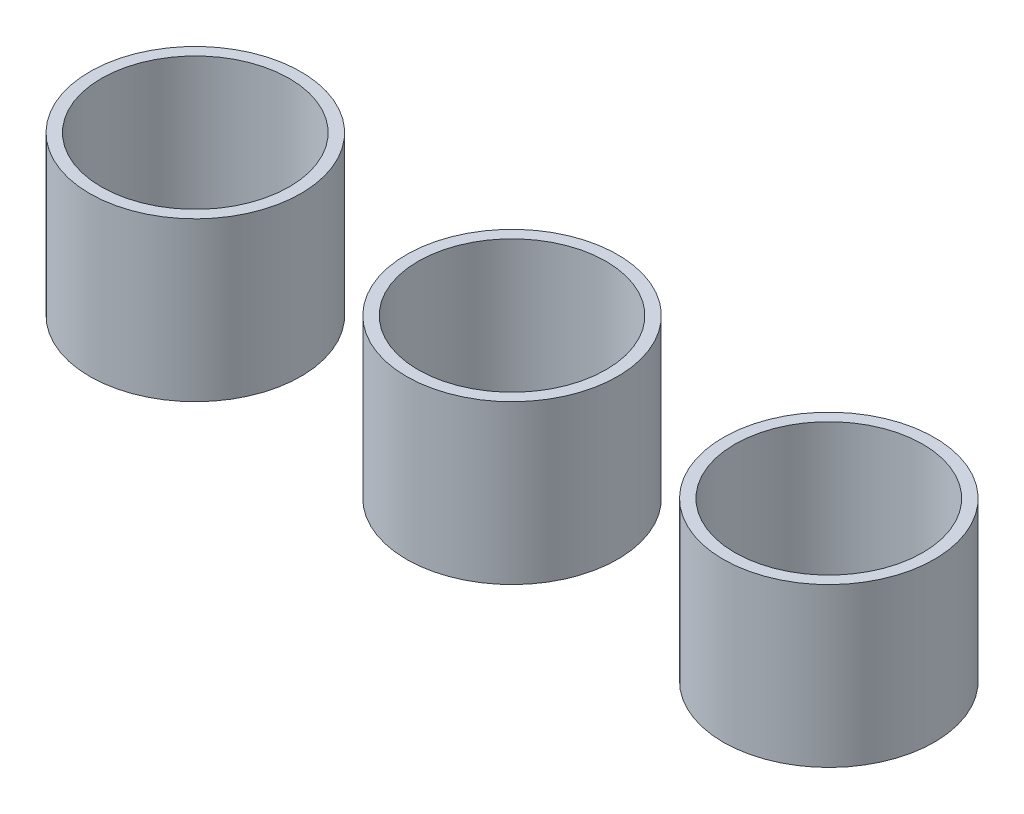
ISO-10303-21;
HEADER;
FILE_DESCRIPTION(('STEP AP214'),'2;1');
FILE_NAME('part.step','',(''),(''),'','','');
FILE_SCHEMA(('AUTOMOTIVE_DESIGN { 1 0 10303 214 1 1 1 1 }'));
ENDSEC;
DATA;
#1=APPLICATION_CONTEXT('core data for automotive mechanical design processes');
#2=APPLICATION_PROTOCOL_DEFINITION('international standard','automotive_design',2000,#1);
#3=PRODUCT_CONTEXT('',#1,'mechanical');
#4=PRODUCT('Part','Part','',(#3));
#5=PRODUCT_RELATED_PRODUCT_CATEGORY('part','',(#4));
#6=PRODUCT_DEFINITION_FORMATION('','',#4);
#7=PRODUCT_DEFINITION_CONTEXT('part definition',#1,'design');
#8=PRODUCT_DEFINITION('design','',#6,#7);
#9=PRODUCT_DEFINITION_SHAPE('','',#8);
#10=(LENGTH_UNIT() NAMED_UNIT(*) SI_UNIT(.MILLI.,.METRE.));
#11=(NAMED_UNIT(*) PLANE_ANGLE_UNIT() SI_UNIT($,.RADIAN.));
#12=(NAMED_UNIT(*) SI_UNIT($,.STERADIAN.) SOLID_ANGLE_UNIT());
#13=UNCERTAINTY_MEASURE_WITH_UNIT(LENGTH_MEASURE(1.E-05),#10,'distance_accuracy_value','');
#14=(GEOMETRIC_REPRESENTATION_CONTEXT(3) GLOBAL_UNCERTAINTY_ASSIGNED_CONTEXT((#13)) GLOBAL_UNIT_ASSIGNED_CONTEXT((#10,
#11,#12)) REPRESENTATION_CONTEXT('',''));
#15=CARTESIAN_POINT('',(0.,0.,0.));
#16=DIRECTION('',(0.,0.,1.));
#17=DIRECTION('',(1.,0.,0.));
#18=AXIS2_PLACEMENT_3D('',#15,#16,#17);
#19=CARTESIAN_POINT('',(60.,15.,0.));
#20=DIRECTION('',(0.,1.,0.));
#21=DIRECTION('',(0.,0.,1.));
#22=AXIS2_PLACEMENT_3D('',#19,#20,#21);
#23=PLANE('',#22);
#24=CARTESIAN_POINT('',(60.,15.,0.));
#25=DIRECTION('',(0.,1.,0.));
#26=DIRECTION('',(0.,0.,1.));
#27=AXIS2_PLACEMENT_3D('',#24,#25,#26);
#28=CIRCLE('',#27,10.);
#29=CARTESIAN_POINT('',(60.,15.,10.));
#30=VERTEX_POINT('',#29);
#31=EDGE_CURVE('E85',#30,#30,#28,.T.);
#32=ORIENTED_EDGE('',*,*,#31,.T.);
#33=EDGE_LOOP('',(#32));
#34=FACE_BOUND('',#33,.T.);
#35=CARTESIAN_POINT('',(60.,15.,0.));
#36=DIRECTION('',(0.,1.,0.));
#37=DIRECTION('',(1.,0.,0.));
#38=AXIS2_PLACEMENT_3D('',#35,#36,#37);
#39=CIRCLE('',#38,8.90000000000001);
#40=CARTESIAN_POINT('',(68.9,15.,0.));
#41=VERTEX_POINT('',#40);
#42=EDGE_CURVE('E74',#41,#41,#39,.T.);
#43=ORIENTED_EDGE('',*,*,#42,.F.);
#44=EDGE_LOOP('',(#43));
#45=FACE_BOUND('',#44,.T.);
#46=ADVANCED_FACE('F70',(#34,#45),#23,.T.);
#47=CARTESIAN_POINT('',(60.,0.,0.));
#48=DIRECTION('',(0.,1.,0.));
#49=DIRECTION('',(0.,0.,1.));
#50=AXIS2_PLACEMENT_3D('',#47,#48,#49);
#51=PLANE('',#50);
#52=CARTESIAN_POINT('',(60.,0.,0.));
#53=DIRECTION('',(0.,1.,0.));
#54=DIRECTION('',(0.,0.,1.));
#55=AXIS2_PLACEMENT_3D('',#52,#53,#54);
#56=CIRCLE('',#55,10.);
#57=CARTESIAN_POINT('',(60.,0.,10.));
#58=VERTEX_POINT('',#57);
#59=EDGE_CURVE('E83',#58,#58,#56,.T.);
#60=ORIENTED_EDGE('',*,*,#59,.F.);
#61=EDGE_LOOP('',(#60));
#62=FACE_BOUND('',#61,.T.);
#63=CARTESIAN_POINT('',(60.,0.,0.));
#64=DIRECTION('',(0.,1.,0.));
#65=DIRECTION('',(1.,0.,0.));
#66=AXIS2_PLACEMENT_3D('',#63,#64,#65);
#67=CIRCLE('',#66,8.90000000000001);
#68=CARTESIAN_POINT('',(68.9,0.,0.));
#69=VERTEX_POINT('',#68);
#70=EDGE_CURVE('E12',#69,#69,#67,.T.);
#71=ORIENTED_EDGE('',*,*,#70,.T.);
#72=EDGE_LOOP('',(#71));
#73=FACE_BOUND('',#72,.T.);
#74=ADVANCED_FACE('F95',(#62,#73),#51,.F.);
#75=CARTESIAN_POINT('',(60.,15.,0.));
#76=DIRECTION('',(0.,-1.,0.));
#77=DIRECTION('',(0.,0.,-1.));
#78=AXIS2_PLACEMENT_3D('',#75,#76,#77);
#79=CYLINDRICAL_SURFACE('',#78,10.);
#80=ORIENTED_EDGE('',*,*,#31,.F.);
#81=EDGE_LOOP('',(#80));
#82=FACE_BOUND('',#81,.T.);
#83=ORIENTED_EDGE('',*,*,#59,.T.);
#84=EDGE_LOOP('',(#83));
#85=FACE_BOUND('',#84,.T.);
#86=ADVANCED_FACE('F93',(#82,#85),#79,.T.);
#87=CARTESIAN_POINT('',(60.,15.,0.));
#88=DIRECTION('',(0.,-1.,0.));
#89=DIRECTION('',(0.,0.,-1.));
#90=AXIS2_PLACEMENT_3D('',#87,#88,#89);
#91=CYLINDRICAL_SURFACE('',#90,8.90000000000001);
#92=ORIENTED_EDGE('',*,*,#42,.T.);
#93=EDGE_LOOP('',(#92));
#94=FACE_BOUND('',#93,.T.);
#95=ORIENTED_EDGE('',*,*,#70,.F.);
#96=EDGE_LOOP('',(#95));
#97=FACE_BOUND('',#96,.T.);
#98=ADVANCED_FACE('F72',(#94,#97),#91,.F.);
#99=CLOSED_SHELL('',(#46,#74,#86,#98));
#100=MANIFOLD_SOLID_BREP('B2',#99);
#101=CARTESIAN_POINT('',(30.,15.,0.));
#102=DIRECTION('',(0.,1.,0.));
#103=DIRECTION('',(0.,0.,1.));
#104=AXIS2_PLACEMENT_3D('',#101,#102,#103);
#105=PLANE('',#104);
#106=CARTESIAN_POINT('',(30.,15.,0.));
#107=DIRECTION('',(0.,1.,0.));
#108=DIRECTION('',(0.,0.,1.));
#109=AXIS2_PLACEMENT_3D('',#106,#107,#108);
#110=CIRCLE('',#109,10.);
#111=CARTESIAN_POINT('',(30.,15.,10.));
#112=VERTEX_POINT('',#111);
#113=EDGE_CURVE('E156',#112,#112,#110,.T.);
#114=ORIENTED_EDGE('',*,*,#113,.T.);
#115=EDGE_LOOP('',(#114));
#116=FACE_BOUND('',#115,.T.);
#117=CARTESIAN_POINT('',(30.,15.,0.));
#118=DIRECTION('',(0.,1.,0.));
#119=DIRECTION('',(1.,0.,0.));
#120=AXIS2_PLACEMENT_3D('',#117,#118,#119);
#121=CIRCLE('',#120,8.9);
#122=CARTESIAN_POINT('',(38.9,15.,0.));
#123=VERTEX_POINT('',#122);
#124=EDGE_CURVE('E147',#123,#123,#121,.T.);
#125=ORIENTED_EDGE('',*,*,#124,.F.);
#126=EDGE_LOOP('',(#125));
#127=FACE_BOUND('',#126,.T.);
#128=ADVANCED_FACE('F143',(#116,#127),#105,.T.);
#129=CARTESIAN_POINT('',(30.,0.,0.));
#130=DIRECTION('',(0.,1.,0.));
#131=DIRECTION('',(0.,0.,1.));
#132=AXIS2_PLACEMENT_3D('',#129,#130,#131);
#133=PLANE('',#132);
#134=CARTESIAN_POINT('',(30.,0.,0.));
#135=DIRECTION('',(0.,1.,0.));
#136=DIRECTION('',(0.,0.,1.));
#137=AXIS2_PLACEMENT_3D('',#134,#135,#136);
#138=CIRCLE('',#137,10.);
#139=CARTESIAN_POINT('',(30.,0.,10.));
#140=VERTEX_POINT('',#139);
#141=EDGE_CURVE('E154',#140,#140,#138,.T.);
#142=ORIENTED_EDGE('',*,*,#141,.F.);
#143=EDGE_LOOP('',(#142));
#144=FACE_BOUND('',#143,.T.);
#145=CARTESIAN_POINT('',(30.,0.,0.));
#146=DIRECTION('',(0.,1.,0.));
#147=DIRECTION('',(1.,0.,0.));
#148=AXIS2_PLACEMENT_3D('',#145,#146,#147);
#149=CIRCLE('',#148,8.9);
#150=CARTESIAN_POINT('',(38.9,0.,0.));
#151=VERTEX_POINT('',#150);
#152=EDGE_CURVE('E69',#151,#151,#149,.T.);
#153=ORIENTED_EDGE('',*,*,#152,.T.);
#154=EDGE_LOOP('',(#153));
#155=FACE_BOUND('',#154,.T.);
#156=ADVANCED_FACE('F164',(#144,#155),#133,.F.);
#157=CARTESIAN_POINT('',(30.,15.,0.));
#158=DIRECTION('',(0.,-1.,0.));
#159=DIRECTION('',(0.,0.,-1.));
#160=AXIS2_PLACEMENT_3D('',#157,#158,#159);
#161=CYLINDRICAL_SURFACE('',#160,10.);
#162=ORIENTED_EDGE('',*,*,#113,.F.);
#163=EDGE_LOOP('',(#162));
#164=FACE_BOUND('',#163,.T.);
#165=ORIENTED_EDGE('',*,*,#141,.T.);
#166=EDGE_LOOP('',(#165));
#167=FACE_BOUND('',#166,.T.);
#168=ADVANCED_FACE('F162',(#164,#167),#161,.T.);
#169=CARTESIAN_POINT('',(30.,15.,0.));
#170=DIRECTION('',(0.,-1.,0.));
#171=DIRECTION('',(0.,0.,-1.));
#172=AXIS2_PLACEMENT_3D('',#169,#170,#171);
#173=CYLINDRICAL_SURFACE('',#172,8.9);
#174=ORIENTED_EDGE('',*,*,#124,.T.);
#175=EDGE_LOOP('',(#174));
#176=FACE_BOUND('',#175,.T.);
#177=ORIENTED_EDGE('',*,*,#152,.F.);
#178=EDGE_LOOP('',(#177));
#179=FACE_BOUND('',#178,.T.);
#180=ADVANCED_FACE('F145',(#176,#179),#173,.F.);
#181=CLOSED_SHELL('',(#128,#156,#168,#180));
#182=MANIFOLD_SOLID_BREP('B7',#181);
#183=CARTESIAN_POINT('',(0.,15.,0.));
#184=DIRECTION('',(0.,1.,0.));
#185=DIRECTION('',(0.,0.,1.));
#186=AXIS2_PLACEMENT_3D('',#183,#184,#185);
#187=PLANE('',#186);
#188=CARTESIAN_POINT('',(0.,15.,0.));
#189=DIRECTION('',(0.,1.,0.));
#190=DIRECTION('',(0.,0.,1.));
#191=AXIS2_PLACEMENT_3D('',#188,#189,#190);
#192=CIRCLE('',#191,10.);
#193=CARTESIAN_POINT('',(0.,15.,10.));
#194=VERTEX_POINT('',#193);
#195=EDGE_CURVE('E142',#194,#194,#192,.T.);
#196=ORIENTED_EDGE('',*,*,#195,.T.);
#197=EDGE_LOOP('',(#196));
#198=FACE_BOUND('',#197,.T.);
#199=CARTESIAN_POINT('',(0.,15.,0.));
#200=DIRECTION('',(0.,1.,0.));
#201=DIRECTION('',(1.,0.,0.));
#202=AXIS2_PLACEMENT_3D('',#199,#200,#201);
#203=CIRCLE('',#202,8.9);
#204=CARTESIAN_POINT('',(8.9,15.,0.));
#205=VERTEX_POINT('',#204);
#206=EDGE_CURVE('E216',#205,#205,#203,.T.);
#207=ORIENTED_EDGE('',*,*,#206,.F.);
#208=EDGE_LOOP('',(#207));
#209=FACE_BOUND('',#208,.T.);
#210=ADVANCED_FACE('F205',(#198,#209),#187,.T.);
#211=CARTESIAN_POINT('',(0.,0.,0.));
#212=DIRECTION('',(0.,1.,0.));
#213=DIRECTION('',(0.,0.,1.));
#214=AXIS2_PLACEMENT_3D('',#211,#212,#213);
#215=PLANE('',#214);
#216=CARTESIAN_POINT('',(0.,0.,0.));
#217=DIRECTION('',(0.,1.,0.));
#218=DIRECTION('',(0.,0.,1.));
#219=AXIS2_PLACEMENT_3D('',#216,#217,#218);
#220=CIRCLE('',#219,10.);
#221=CARTESIAN_POINT('',(0.,0.,10.));
#222=VERTEX_POINT('',#221);
#223=EDGE_CURVE('E209',#222,#222,#220,.T.);
#224=ORIENTED_EDGE('',*,*,#223,.F.);
#225=EDGE_LOOP('',(#224));
#226=FACE_BOUND('',#225,.T.);
#227=CARTESIAN_POINT('',(0.,0.,0.));
#228=DIRECTION('',(0.,1.,0.));
#229=DIRECTION('',(1.,0.,0.));
#230=AXIS2_PLACEMENT_3D('',#227,#228,#229);
#231=CIRCLE('',#230,8.9);
#232=CARTESIAN_POINT('',(8.9,0.,0.));
#233=VERTEX_POINT('',#232);
#234=EDGE_CURVE('E218',#233,#233,#231,.T.);
#235=ORIENTED_EDGE('',*,*,#234,.T.);
#236=EDGE_LOOP('',(#235));
#237=FACE_BOUND('',#236,.T.);
#238=ADVANCED_FACE('F228',(#226,#237),#215,.F.);
#239=CARTESIAN_POINT('',(0.,15.,0.));
#240=DIRECTION('',(0.,-1.,0.));
#241=DIRECTION('',(0.,0.,-1.));
#242=AXIS2_PLACEMENT_3D('',#239,#240,#241);
#243=CYLINDRICAL_SURFACE('',#242,10.);
#244=ORIENTED_EDGE('',*,*,#195,.F.);
#245=EDGE_LOOP('',(#244));
#246=FACE_BOUND('',#245,.T.);
#247=ORIENTED_EDGE('',*,*,#223,.T.);
#248=EDGE_LOOP('',(#247));
#249=FACE_BOUND('',#248,.T.);
#250=ADVANCED_FACE('F207',(#246,#249),#243,.T.);
#251=CARTESIAN_POINT('',(0.,15.,0.));
#252=DIRECTION('',(0.,-1.,0.));
#253=DIRECTION('',(0.,0.,-1.));
#254=AXIS2_PLACEMENT_3D('',#251,#252,#253);
#255=CYLINDRICAL_SURFACE('',#254,8.9);
#256=ORIENTED_EDGE('',*,*,#206,.T.);
#257=EDGE_LOOP('',(#256));
#258=FACE_BOUND('',#257,.T.);
#259=ORIENTED_EDGE('',*,*,#234,.F.);
#260=EDGE_LOOP('',(#259));
#261=FACE_BOUND('',#260,.T.);
#262=ADVANCED_FACE('F224',(#258,#261),#255,.F.);
#263=CLOSED_SHELL('',(#210,#238,#250,#262));
#264=MANIFOLD_SOLID_BREP('B64',#263);
#265=ADVANCED_BREP_SHAPE_REPRESENTATION('',(#18,#100,#182,#264),#14);
#266=SHAPE_DEFINITION_REPRESENTATION(#9,#265);
ENDSEC;
END-ISO-10303-21;
